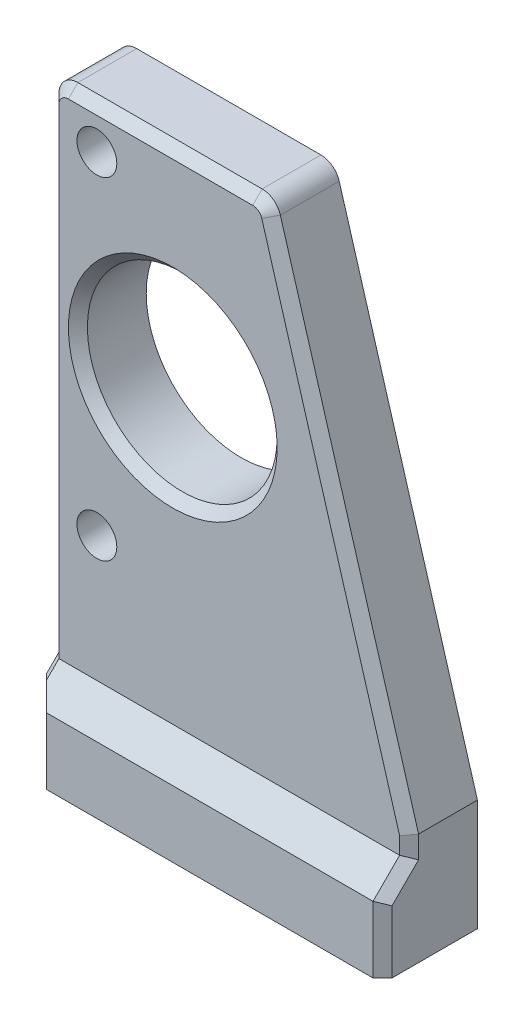
ISO-10303-21;
HEADER;
FILE_DESCRIPTION(('STEP AP214'),'2;1');
FILE_NAME('part.step','',(''),(''),'','','');
FILE_SCHEMA(('AUTOMOTIVE_DESIGN { 1 0 10303 214 1 1 1 1 }'));
ENDSEC;
DATA;
#1=APPLICATION_CONTEXT('core data for automotive mechanical design processes');
#2=APPLICATION_PROTOCOL_DEFINITION('international standard','automotive_design',2000,#1);
#3=PRODUCT_CONTEXT('',#1,'mechanical');
#4=PRODUCT('Part','Part','',(#3));
#5=PRODUCT_RELATED_PRODUCT_CATEGORY('part','',(#4));
#6=PRODUCT_DEFINITION_FORMATION('','',#4);
#7=PRODUCT_DEFINITION_CONTEXT('part definition',#1,'design');
#8=PRODUCT_DEFINITION('design','',#6,#7);
#9=PRODUCT_DEFINITION_SHAPE('','',#8);
#10=(LENGTH_UNIT() NAMED_UNIT(*) SI_UNIT(.MILLI.,.METRE.));
#11=(NAMED_UNIT(*) PLANE_ANGLE_UNIT() SI_UNIT($,.RADIAN.));
#12=(NAMED_UNIT(*) SI_UNIT($,.STERADIAN.) SOLID_ANGLE_UNIT());
#13=UNCERTAINTY_MEASURE_WITH_UNIT(LENGTH_MEASURE(1.E-05),#10,'distance_accuracy_value','');
#14=(GEOMETRIC_REPRESENTATION_CONTEXT(3) GLOBAL_UNCERTAINTY_ASSIGNED_CONTEXT((#13)) GLOBAL_UNIT_ASSIGNED_CONTEXT((#10,
#11,#12)) REPRESENTATION_CONTEXT('',''));
#15=CARTESIAN_POINT('',(0.,0.,0.));
#16=DIRECTION('',(0.,0.,1.));
#17=DIRECTION('',(1.,0.,0.));
#18=AXIS2_PLACEMENT_3D('',#15,#16,#17);
#19=CARTESIAN_POINT('',(-8.08878115586111,23.0319457170168,10.));
#20=DIRECTION('',(0.,0.,-1.));
#21=DIRECTION('',(-1.,0.,0.));
#22=AXIS2_PLACEMENT_3D('',#19,#20,#21);
#23=CYLINDRICAL_SURFACE('',#22,2.1);
#24=CARTESIAN_POINT('',(-8.08878115586111,23.0319457170168,3.60000000000001));
#25=DIRECTION('',(0.,0.,-1.));
#26=DIRECTION('',(-1.,0.,0.));
#27=AXIS2_PLACEMENT_3D('',#24,#25,#26);
#28=CIRCLE('',#27,2.1);
#29=CARTESIAN_POINT('',(-10.1887811558611,23.0319457170168,3.60000000000001));
#30=VERTEX_POINT('',#29);
#31=EDGE_CURVE('E44',#30,#30,#28,.T.);
#32=ORIENTED_EDGE('',*,*,#31,.T.);
#33=EDGE_LOOP('',(#32));
#34=FACE_BOUND('',#33,.T.);
#35=CARTESIAN_POINT('',(-8.08878115586111,23.0319457170168,7.2));
#36=DIRECTION('',(0.,0.,1.));
#37=DIRECTION('',(1.,0.,0.));
#38=AXIS2_PLACEMENT_3D('',#35,#36,#37);
#39=CIRCLE('',#38,2.1);
#40=CARTESIAN_POINT('',(-5.98878115586111,23.0319457170168,7.2));
#41=VERTEX_POINT('',#40);
#42=EDGE_CURVE('E183',#41,#41,#39,.T.);
#43=ORIENTED_EDGE('',*,*,#42,.T.);
#44=EDGE_LOOP('',(#43));
#45=FACE_BOUND('',#44,.T.);
#46=ADVANCED_FACE('F36',(#34,#45),#23,.F.);
#47=CARTESIAN_POINT('',(-13.0887811558611,62.3706180274269,10.));
#48=DIRECTION('',(0.,-1.,0.));
#49=DIRECTION('',(0.,0.,-1.));
#50=AXIS2_PLACEMENT_3D('',#47,#48,#49);
#51=PLANE('',#50);
#52=DIRECTION('',(0.,0.,-1.));
#53=VECTOR('',#52,1.);
#54=CARTESIAN_POINT('',(-11.0887811558611,62.3706180274269,10.));
#55=LINE('',#54,#53);
#56=CARTESIAN_POINT('',(-11.0887811558611,62.3706180274269,0.));
#57=VERTEX_POINT('',#56);
#58=CARTESIAN_POINT('',(-11.0887811558611,62.3706180274269,6.2));
#59=VERTEX_POINT('',#58);
#60=EDGE_CURVE('E201',#57,#59,#55,.F.);
#61=ORIENTED_EDGE('',*,*,#60,.T.);
#62=DIRECTION('',(1.,0.,0.));
#63=VECTOR('',#62,1.);
#64=CARTESIAN_POINT('',(8.33058138017552,62.3706180274269,6.2));
#65=LINE('',#64,#63);
#66=CARTESIAN_POINT('',(8.33058138017552,62.3706180274269,6.2));
#67=VERTEX_POINT('',#66);
#68=EDGE_CURVE('E249',#59,#67,#65,.T.);
#69=ORIENTED_EDGE('',*,*,#68,.T.);
#70=DIRECTION('',(0.,0.,-1.));
#71=VECTOR('',#70,1.);
#72=CARTESIAN_POINT('',(8.33058138017552,62.3706180274269,10.));
#73=LINE('',#72,#71);
#74=CARTESIAN_POINT('',(8.33058138017552,62.3706180274269,0.));
#75=VERTEX_POINT('',#74);
#76=EDGE_CURVE('E199',#67,#75,#73,.T.);
#77=ORIENTED_EDGE('',*,*,#76,.T.);
#78=DIRECTION('',(-1.,0.,0.));
#79=VECTOR('',#78,1.);
#80=CARTESIAN_POINT('',(-13.0887811558611,62.3706180274269,0.));
#81=LINE('',#80,#79);
#82=EDGE_CURVE('E177',#75,#57,#81,.T.);
#83=ORIENTED_EDGE('',*,*,#82,.T.);
#84=EDGE_LOOP('',(#61,#69,#77,#83));
#85=FACE_BOUND('',#84,.T.);
#86=ADVANCED_FACE('F298',(#85),#51,.F.);
#87=CARTESIAN_POINT('',(-8.08878115586112,58.0319457170168,10.));
#88=DIRECTION('',(0.,0.,-1.));
#89=DIRECTION('',(-1.,0.,0.));
#90=AXIS2_PLACEMENT_3D('',#87,#88,#89);
#91=CYLINDRICAL_SURFACE('',#90,2.1);
#92=CARTESIAN_POINT('',(-8.08878115586112,58.0319457170168,0.));
#93=DIRECTION('',(0.,0.,1.));
#94=DIRECTION('',(-1.,0.,0.));
#95=AXIS2_PLACEMENT_3D('',#92,#93,#94);
#96=CIRCLE('',#95,2.1);
#97=CARTESIAN_POINT('',(-10.1887811558611,58.0319457170168,0.));
#98=VERTEX_POINT('',#97);
#99=EDGE_CURVE('E423',#98,#98,#96,.T.);
#100=ORIENTED_EDGE('',*,*,#99,.F.);
#101=EDGE_LOOP('',(#100));
#102=FACE_BOUND('',#101,.T.);
#103=CARTESIAN_POINT('',(-8.08878115586112,58.0319457170168,7.2));
#104=DIRECTION('',(0.,0.,1.));
#105=DIRECTION('',(1.,0.,0.));
#106=AXIS2_PLACEMENT_3D('',#103,#104,#105);
#107=CIRCLE('',#106,2.1);
#108=CARTESIAN_POINT('',(-5.98878115586112,58.0319457170168,7.2));
#109=VERTEX_POINT('',#108);
#110=EDGE_CURVE('E186',#109,#109,#107,.T.);
#111=ORIENTED_EDGE('',*,*,#110,.T.);
#112=EDGE_LOOP('',(#111));
#113=FACE_BOUND('',#112,.T.);
#114=ADVANCED_FACE('F303',(#102,#113),#91,.F.);
#115=CARTESIAN_POINT('',(0.,0.,10.));
#116=DIRECTION('',(0.,0.,-1.));
#117=DIRECTION('',(-1.,0.,0.));
#118=AXIS2_PLACEMENT_3D('',#115,#116,#117);
#119=PLANE('',#118);
#120=DIRECTION('',(-1.,0.,0.));
#121=VECTOR('',#120,1.);
#122=CARTESIAN_POINT('',(0.,6.99999999999997,10.));
#123=LINE('',#122,#121);
#124=CARTESIAN_POINT('',(23.8127338897394,6.99999999999997,10.));
#125=VERTEX_POINT('',#124);
#126=CARTESIAN_POINT('',(-10.5887811558611,6.99999999999997,10.));
#127=VERTEX_POINT('',#126);
#128=EDGE_CURVE('E182',#125,#127,#123,.T.);
#129=ORIENTED_EDGE('',*,*,#128,.T.);
#130=DIRECTION('',(0.,-1.,0.));
#131=VECTOR('',#130,1.);
#132=CARTESIAN_POINT('',(-10.5887811558611,0.,10.));
#133=LINE('',#132,#131);
#134=CARTESIAN_POINT('',(-10.5887811558611,0.,10.));
#135=VERTEX_POINT('',#134);
#136=EDGE_CURVE('E251',#127,#135,#133,.T.);
#137=ORIENTED_EDGE('',*,*,#136,.T.);
#138=DIRECTION('',(1.,0.,0.));
#139=VECTOR('',#138,1.);
#140=CARTESIAN_POINT('',(28.2870012815656,0.,10.));
#141=LINE('',#140,#139);
#142=CARTESIAN_POINT('',(23.8127338897394,0.,10.));
#143=VERTEX_POINT('',#142);
#144=EDGE_CURVE('E173',#135,#143,#141,.T.);
#145=ORIENTED_EDGE('',*,*,#144,.T.);
#146=DIRECTION('',(0.,1.,0.));
#147=VECTOR('',#146,1.);
#148=CARTESIAN_POINT('',(23.8127338897394,0.,10.));
#149=LINE('',#148,#147);
#150=EDGE_CURVE('E225',#143,#125,#149,.T.);
#151=ORIENTED_EDGE('',*,*,#150,.T.);
#152=EDGE_LOOP('',(#129,#137,#145,#151));
#153=FACE_BOUND('',#152,.T.);
#154=ADVANCED_FACE('F312',(#153),#119,.F.);
#155=CARTESIAN_POINT('',(0.,0.,0.));
#156=DIRECTION('',(0.,0.,-1.));
#157=DIRECTION('',(-1.,0.,0.));
#158=AXIS2_PLACEMENT_3D('',#155,#156,#157);
#159=PLANE('',#158);
#160=CARTESIAN_POINT('',(-8.08878115586111,23.0319457170168,0.));
#161=DIRECTION('',(0.,0.,-1.));
#162=DIRECTION('',(-1.,0.,0.));
#163=AXIS2_PLACEMENT_3D('',#160,#161,#162);
#164=CIRCLE('',#163,3.6);
#165=CARTESIAN_POINT('',(-11.6887811558611,23.0319457170168,0.));
#166=VERTEX_POINT('',#165);
#167=EDGE_CURVE('E451',#166,#166,#164,.T.);
#168=ORIENTED_EDGE('',*,*,#167,.F.);
#169=EDGE_LOOP('',(#168));
#170=FACE_BOUND('',#169,.T.);
#171=DIRECTION('',(0.,-1.,0.));
#172=VECTOR('',#171,1.);
#173=CARTESIAN_POINT('',(-13.0887811558611,0.,0.));
#174=LINE('',#173,#172);
#175=CARTESIAN_POINT('',(-13.0887811558611,60.3706180274269,0.));
#176=VERTEX_POINT('',#175);
#177=CARTESIAN_POINT('',(-13.0887811558611,0.,0.));
#178=VERTEX_POINT('',#177);
#179=EDGE_CURVE('E174',#176,#178,#174,.T.);
#180=ORIENTED_EDGE('',*,*,#179,.F.);
#181=CARTESIAN_POINT('',(-11.0887811558611,60.3706180274269,0.));
#182=DIRECTION('',(0.,0.,-1.));
#183=DIRECTION('',(-1.,0.,0.));
#184=AXIS2_PLACEMENT_3D('',#181,#182,#183);
#185=CIRCLE('',#184,2.);
#186=EDGE_CURVE('E197',#176,#57,#185,.T.);
#187=ORIENTED_EDGE('',*,*,#186,.T.);
#188=ORIENTED_EDGE('',*,*,#82,.F.);
#189=CARTESIAN_POINT('',(8.33058138017552,60.3706180274269,0.));
#190=DIRECTION('',(0.,0.,-1.));
#191=DIRECTION('',(-1.,0.,0.));
#192=AXIS2_PLACEMENT_3D('',#189,#190,#191);
#193=CIRCLE('',#192,2.);
#194=CARTESIAN_POINT('',(10.2483242545276,60.9382995119514,0.));
#195=VERTEX_POINT('',#194);
#196=EDGE_CURVE('E195',#75,#195,#193,.T.);
#197=ORIENTED_EDGE('',*,*,#196,.T.);
#198=DIRECTION('',(-0.283840742262227,0.958871437176032,0.));
#199=VECTOR('',#198,1.);
#200=CARTESIAN_POINT('',(24.8127338897394,11.7367779571846,0.));
#201=LINE('',#200,#199);
#202=CARTESIAN_POINT('',(24.8127338897394,11.7367779571846,0.));
#203=VERTEX_POINT('',#202);
#204=EDGE_CURVE('E158',#203,#195,#201,.T.);
#205=ORIENTED_EDGE('',*,*,#204,.F.);
#206=DIRECTION('',(0.,1.,0.));
#207=VECTOR('',#206,1.);
#208=CARTESIAN_POINT('',(24.8127338897394,11.7367779571846,0.));
#209=LINE('',#208,#207);
#210=CARTESIAN_POINT('',(24.8127338897394,0.,0.));
#211=VERTEX_POINT('',#210);
#212=EDGE_CURVE('E149',#211,#203,#209,.T.);
#213=ORIENTED_EDGE('',*,*,#212,.F.);
#214=DIRECTION('',(1.,0.,0.));
#215=VECTOR('',#214,1.);
#216=CARTESIAN_POINT('',(28.2870012815656,0.,0.));
#217=LINE('',#216,#215);
#218=EDGE_CURVE('E165',#178,#211,#217,.T.);
#219=ORIENTED_EDGE('',*,*,#218,.F.);
#220=EDGE_LOOP('',(#180,#187,#188,#197,#205,#213,#219));
#221=FACE_BOUND('',#220,.T.);
#222=CARTESIAN_POINT('',(-0.0887811558611135,40.5319457170168,0.));
#223=DIRECTION('',(0.,0.,1.));
#224=DIRECTION('',(1.,0.,0.));
#225=AXIS2_PLACEMENT_3D('',#222,#223,#224);
#226=CIRCLE('',#225,10.);
#227=CARTESIAN_POINT('',(9.91121884413889,40.5319457170168,0.));
#228=VERTEX_POINT('',#227);
#229=EDGE_CURVE('E187',#228,#228,#226,.T.);
#230=ORIENTED_EDGE('',*,*,#229,.T.);
#231=EDGE_LOOP('',(#230));
#232=FACE_BOUND('',#231,.T.);
#233=ORIENTED_EDGE('',*,*,#99,.T.);
#234=EDGE_LOOP('',(#233));
#235=FACE_BOUND('',#234,.T.);
#236=ADVANCED_FACE('F163',(#170,#221,#232,#235),#159,.T.);
#237=CARTESIAN_POINT('',(-13.0887811558611,0.,10.));
#238=DIRECTION('',(1.,0.,0.));
#239=DIRECTION('',(0.,0.,-1.));
#240=AXIS2_PLACEMENT_3D('',#237,#238,#239);
#241=PLANE('',#240);
#242=DIRECTION('',(0.,0.,-1.));
#243=VECTOR('',#242,1.);
#244=CARTESIAN_POINT('',(-13.0887811558611,0.,10.));
#245=LINE('',#244,#243);
#246=CARTESIAN_POINT('',(-13.0887811558611,0.,7.49999999999999));
#247=VERTEX_POINT('',#246);
#248=EDGE_CURVE('E171',#247,#178,#245,.T.);
#249=ORIENTED_EDGE('',*,*,#248,.F.);
#250=DIRECTION('',(0.,1.,0.));
#251=VECTOR('',#250,1.);
#252=CARTESIAN_POINT('',(-13.0887811558611,0.,7.49999999999999));
#253=LINE('',#252,#251);
#254=CARTESIAN_POINT('',(-13.0887811558611,8.08578643762687,7.49999999999999));
#255=VERTEX_POINT('',#254);
#256=EDGE_CURVE('E59',#247,#255,#253,.T.);
#257=ORIENTED_EDGE('',*,*,#256,.T.);
#258=DIRECTION('',(0.,0.707106781186544,-0.707106781186551));
#259=VECTOR('',#258,1.);
#260=CARTESIAN_POINT('',(-13.0887811558611,9.0928932188134,6.49289321881346));
#261=LINE('',#260,#259);
#262=CARTESIAN_POINT('',(-13.0887811558611,9.38578643762685,6.2));
#263=VERTEX_POINT('',#262);
#264=EDGE_CURVE('E241',#255,#263,#261,.T.);
#265=ORIENTED_EDGE('',*,*,#264,.T.);
#266=DIRECTION('',(0.,1.,0.));
#267=VECTOR('',#266,1.);
#268=CARTESIAN_POINT('',(-13.0887811558611,60.3706180274269,6.2));
#269=LINE('',#268,#267);
#270=CARTESIAN_POINT('',(-13.0887811558611,60.3706180274269,6.2));
#271=VERTEX_POINT('',#270);
#272=EDGE_CURVE('E239',#263,#271,#269,.T.);
#273=ORIENTED_EDGE('',*,*,#272,.T.);
#274=DIRECTION('',(0.,0.,-1.));
#275=VECTOR('',#274,1.);
#276=CARTESIAN_POINT('',(-13.0887811558611,60.3706180274269,10.));
#277=LINE('',#276,#275);
#278=EDGE_CURVE('E193',#271,#176,#277,.T.);
#279=ORIENTED_EDGE('',*,*,#278,.T.);
#280=ORIENTED_EDGE('',*,*,#179,.T.);
#281=EDGE_LOOP('',(#249,#257,#265,#273,#279,#280));
#282=FACE_BOUND('',#281,.T.);
#283=ADVANCED_FACE('F319',(#282),#241,.F.);
#284=CARTESIAN_POINT('',(28.2870012815656,0.,10.));
#285=DIRECTION('',(0.,1.,0.));
#286=DIRECTION('',(-1.,0.,0.));
#287=AXIS2_PLACEMENT_3D('',#284,#285,#286);
#288=PLANE('',#287);
#289=CARTESIAN_POINT('',(6.18,0.,5.));
#290=DIRECTION('',(0.,-1.,0.));
#291=DIRECTION('',(1.,0.,0.));
#292=AXIS2_PLACEMENT_3D('',#289,#290,#291);
#293=CIRCLE('',#292,1.5);
#294=CARTESIAN_POINT('',(7.68,0.,5.));
#295=VERTEX_POINT('',#294);
#296=EDGE_CURVE('E440',#295,#295,#293,.T.);
#297=ORIENTED_EDGE('',*,*,#296,.F.);
#298=EDGE_LOOP('',(#297));
#299=FACE_BOUND('',#298,.T.);
#300=CARTESIAN_POINT('',(19.36,0.,5.));
#301=DIRECTION('',(0.,-1.,0.));
#302=DIRECTION('',(1.,0.,0.));
#303=AXIS2_PLACEMENT_3D('',#300,#301,#302);
#304=CIRCLE('',#303,1.5);
#305=CARTESIAN_POINT('',(20.86,0.,5.));
#306=VERTEX_POINT('',#305);
#307=EDGE_CURVE('E434',#306,#306,#304,.T.);
#308=ORIENTED_EDGE('',*,*,#307,.F.);
#309=EDGE_LOOP('',(#308));
#310=FACE_BOUND('',#309,.T.);
#311=CARTESIAN_POINT('',(-7.,0.,5.));
#312=DIRECTION('',(0.,-1.,0.));
#313=DIRECTION('',(1.,0.,0.));
#314=AXIS2_PLACEMENT_3D('',#311,#312,#313);
#315=CIRCLE('',#314,1.5);
#316=CARTESIAN_POINT('',(-5.5,0.,5.));
#317=VERTEX_POINT('',#316);
#318=EDGE_CURVE('E428',#317,#317,#315,.T.);
#319=ORIENTED_EDGE('',*,*,#318,.F.);
#320=EDGE_LOOP('',(#319));
#321=FACE_BOUND('',#320,.T.);
#322=ORIENTED_EDGE('',*,*,#144,.F.);
#323=DIRECTION('',(0.707106781186547,0.,0.707106781186549));
#324=VECTOR('',#323,1.);
#325=CARTESIAN_POINT('',(-10.5887811558611,0.,10.));
#326=LINE('',#325,#324);
#327=EDGE_CURVE('E277',#135,#247,#326,.F.);
#328=ORIENTED_EDGE('',*,*,#327,.T.);
#329=ORIENTED_EDGE('',*,*,#248,.T.);
#330=ORIENTED_EDGE('',*,*,#218,.T.);
#331=DIRECTION('',(0.,0.,-1.));
#332=VECTOR('',#331,1.);
#333=CARTESIAN_POINT('',(24.8127338897394,0.,10.));
#334=LINE('',#333,#332);
#335=CARTESIAN_POINT('',(24.8127338897394,0.,9.00000000000001));
#336=VERTEX_POINT('',#335);
#337=EDGE_CURVE('E145',#336,#211,#334,.T.);
#338=ORIENTED_EDGE('',*,*,#337,.F.);
#339=DIRECTION('',(0.70710678118655,0.,-0.707106781186545));
#340=VECTOR('',#339,1.);
#341=CARTESIAN_POINT('',(23.8127338897394,0.,10.));
#342=LINE('',#341,#340);
#343=EDGE_CURVE('E233',#336,#143,#342,.F.);
#344=ORIENTED_EDGE('',*,*,#343,.T.);
#345=EDGE_LOOP('',(#322,#328,#329,#330,#338,#344));
#346=FACE_BOUND('',#345,.T.);
#347=ADVANCED_FACE('F170',(#299,#310,#321,#346),#288,.F.);
#348=CARTESIAN_POINT('',(-7.,8.,5.));
#349=DIRECTION('',(0.,-1.,0.));
#350=DIRECTION('',(1.,0.,0.));
#351=AXIS2_PLACEMENT_3D('',#348,#349,#350);
#352=CYLINDRICAL_SURFACE('',#351,1.5);
#353=CARTESIAN_POINT('',(-7.,8.,5.));
#354=DIRECTION('',(0.,-1.,0.));
#355=DIRECTION('',(1.,0.,0.));
#356=AXIS2_PLACEMENT_3D('',#353,#354,#355);
#357=CIRCLE('',#356,1.5);
#358=CARTESIAN_POINT('',(-5.5,8.,5.));
#359=VERTEX_POINT('',#358);
#360=EDGE_CURVE('E425',#359,#359,#357,.T.);
#361=ORIENTED_EDGE('',*,*,#360,.F.);
#362=EDGE_LOOP('',(#361));
#363=FACE_BOUND('',#362,.T.);
#364=ORIENTED_EDGE('',*,*,#318,.T.);
#365=EDGE_LOOP('',(#364));
#366=FACE_BOUND('',#365,.T.);
#367=ADVANCED_FACE('F308',(#363,#366),#352,.F.);
#368=CARTESIAN_POINT('',(-7.,8.,5.));
#369=DIRECTION('',(0.,-1.,0.));
#370=DIRECTION('',(1.,0.,0.));
#371=AXIS2_PLACEMENT_3D('',#368,#369,#370);
#372=PLANE('',#371);
#373=ORIENTED_EDGE('',*,*,#360,.T.);
#374=EDGE_LOOP('',(#373));
#375=FACE_BOUND('',#374,.T.);
#376=ADVANCED_FACE('F488',(#375),#372,.T.);
#377=CARTESIAN_POINT('',(19.36,8.,5.));
#378=DIRECTION('',(0.,-1.,0.));
#379=DIRECTION('',(1.,0.,0.));
#380=AXIS2_PLACEMENT_3D('',#377,#378,#379);
#381=CYLINDRICAL_SURFACE('',#380,1.5);
#382=CARTESIAN_POINT('',(19.36,8.,5.));
#383=DIRECTION('',(0.,-1.,0.));
#384=DIRECTION('',(1.,0.,0.));
#385=AXIS2_PLACEMENT_3D('',#382,#383,#384);
#386=CIRCLE('',#385,1.5);
#387=CARTESIAN_POINT('',(20.86,8.,5.));
#388=VERTEX_POINT('',#387);
#389=EDGE_CURVE('E437',#388,#388,#386,.T.);
#390=ORIENTED_EDGE('',*,*,#389,.F.);
#391=EDGE_LOOP('',(#390));
#392=FACE_BOUND('',#391,.T.);
#393=ORIENTED_EDGE('',*,*,#307,.T.);
#394=EDGE_LOOP('',(#393));
#395=FACE_BOUND('',#394,.T.);
#396=ADVANCED_FACE('F485',(#392,#395),#381,.F.);
#397=CARTESIAN_POINT('',(19.36,8.,5.));
#398=DIRECTION('',(0.,-1.,0.));
#399=DIRECTION('',(1.,0.,0.));
#400=AXIS2_PLACEMENT_3D('',#397,#398,#399);
#401=PLANE('',#400);
#402=ORIENTED_EDGE('',*,*,#389,.T.);
#403=EDGE_LOOP('',(#402));
#404=FACE_BOUND('',#403,.T.);
#405=ADVANCED_FACE('F481',(#404),#401,.T.);
#406=CARTESIAN_POINT('',(6.18,8.,5.));
#407=DIRECTION('',(0.,-1.,0.));
#408=DIRECTION('',(1.,0.,0.));
#409=AXIS2_PLACEMENT_3D('',#406,#407,#408);
#410=CYLINDRICAL_SURFACE('',#409,1.5);
#411=CARTESIAN_POINT('',(6.18,8.,5.));
#412=DIRECTION('',(0.,-1.,0.));
#413=DIRECTION('',(1.,0.,0.));
#414=AXIS2_PLACEMENT_3D('',#411,#412,#413);
#415=CIRCLE('',#414,1.5);
#416=CARTESIAN_POINT('',(7.68,8.,5.));
#417=VERTEX_POINT('',#416);
#418=EDGE_CURVE('E431',#417,#417,#415,.T.);
#419=ORIENTED_EDGE('',*,*,#418,.F.);
#420=EDGE_LOOP('',(#419));
#421=FACE_BOUND('',#420,.T.);
#422=ORIENTED_EDGE('',*,*,#296,.T.);
#423=EDGE_LOOP('',(#422));
#424=FACE_BOUND('',#423,.T.);
#425=ADVANCED_FACE('F477',(#421,#424),#410,.F.);
#426=CARTESIAN_POINT('',(6.18,8.,5.));
#427=DIRECTION('',(0.,-1.,0.));
#428=DIRECTION('',(1.,0.,0.));
#429=AXIS2_PLACEMENT_3D('',#426,#427,#428);
#430=PLANE('',#429);
#431=ORIENTED_EDGE('',*,*,#418,.T.);
#432=EDGE_LOOP('',(#431));
#433=FACE_BOUND('',#432,.T.);
#434=ADVANCED_FACE('F473',(#433),#430,.T.);
#435=CARTESIAN_POINT('',(0.,0.,7.2));
#436=DIRECTION('',(0.,0.,1.));
#437=DIRECTION('',(1.,0.,0.));
#438=AXIS2_PLACEMENT_3D('',#435,#436,#437);
#439=PLANE('',#438);
#440=CARTESIAN_POINT('',(-0.0887811558611135,40.5319457170168,7.2));
#441=DIRECTION('',(0.,0.,1.));
#442=DIRECTION('',(1.,0.,0.));
#443=AXIS2_PLACEMENT_3D('',#440,#441,#442);
#444=CIRCLE('',#443,11.);
#445=CARTESIAN_POINT('',(10.9112188441389,40.5319457170168,7.2));
#446=VERTEX_POINT('',#445);
#447=EDGE_CURVE('E222',#446,#446,#444,.F.);
#448=ORIENTED_EDGE('',*,*,#447,.T.);
#449=EDGE_LOOP('',(#448));
#450=FACE_BOUND('',#449,.T.);
#451=DIRECTION('',(-1.,0.,0.));
#452=VECTOR('',#451,1.);
#453=CARTESIAN_POINT('',(-15.0951683588392,9.79999999999994,7.2));
#454=LINE('',#453,#452);
#455=CARTESIAN_POINT('',(-12.0887811558611,9.79999999999994,7.2));
#456=VERTEX_POINT('',#455);
#457=CARTESIAN_POINT('',(23.8127338897394,9.79999999999994,7.2));
#458=VERTEX_POINT('',#457);
#459=EDGE_CURVE('E190',#456,#458,#454,.F.);
#460=ORIENTED_EDGE('',*,*,#459,.T.);
#461=DIRECTION('',(0.,1.,0.));
#462=VECTOR('',#461,1.);
#463=CARTESIAN_POINT('',(23.8127338897394,11.7367779571846,7.2));
#464=LINE('',#463,#462);
#465=CARTESIAN_POINT('',(23.8127338897394,11.5918778188318,7.2));
#466=VERTEX_POINT('',#465);
#467=EDGE_CURVE('E220',#458,#466,#464,.T.);
#468=ORIENTED_EDGE('',*,*,#467,.T.);
#469=DIRECTION('',(-0.283840742262227,0.958871437176032,0.));
#470=VECTOR('',#469,1.);
#471=CARTESIAN_POINT('',(9.28945281735155,60.6544587696892,7.2));
#472=LINE('',#471,#470);
#473=CARTESIAN_POINT('',(9.28945281735156,60.6544587696892,7.2));
#474=VERTEX_POINT('',#473);
#475=EDGE_CURVE('E218',#466,#474,#472,.T.);
#476=ORIENTED_EDGE('',*,*,#475,.T.);
#477=CARTESIAN_POINT('',(8.33058138017552,60.3706180274269,7.2));
#478=DIRECTION('',(0.,0.,1.));
#479=DIRECTION('',(1.,0.,0.));
#480=AXIS2_PLACEMENT_3D('',#477,#478,#479);
#481=CIRCLE('',#480,1.00000000000001);
#482=CARTESIAN_POINT('',(8.33058138017552,61.3706180274269,7.2));
#483=VERTEX_POINT('',#482);
#484=EDGE_CURVE('E214',#474,#483,#481,.T.);
#485=ORIENTED_EDGE('',*,*,#484,.T.);
#486=DIRECTION('',(-1.,0.,0.));
#487=VECTOR('',#486,1.);
#488=CARTESIAN_POINT('',(-11.0887811558611,61.3706180274269,7.2));
#489=LINE('',#488,#487);
#490=CARTESIAN_POINT('',(-11.0887811558611,61.3706180274269,7.2));
#491=VERTEX_POINT('',#490);
#492=EDGE_CURVE('E210',#483,#491,#489,.T.);
#493=ORIENTED_EDGE('',*,*,#492,.T.);
#494=CARTESIAN_POINT('',(-11.0887811558611,60.3706180274269,7.2));
#495=DIRECTION('',(0.,0.,1.));
#496=DIRECTION('',(1.,0.,0.));
#497=AXIS2_PLACEMENT_3D('',#494,#495,#496);
#498=CIRCLE('',#497,1.00000000000001);
#499=CARTESIAN_POINT('',(-12.0887811558611,60.3706180274269,7.2));
#500=VERTEX_POINT('',#499);
#501=EDGE_CURVE('E212',#491,#500,#498,.T.);
#502=ORIENTED_EDGE('',*,*,#501,.T.);
#503=DIRECTION('',(0.,-1.,0.));
#504=VECTOR('',#503,1.);
#505=CARTESIAN_POINT('',(-12.0887811558611,9.79999999999994,7.2));
#506=LINE('',#505,#504);
#507=EDGE_CURVE('E216',#500,#456,#506,.T.);
#508=ORIENTED_EDGE('',*,*,#507,.T.);
#509=EDGE_LOOP('',(#460,#468,#476,#485,#493,#502,#508));
#510=FACE_BOUND('',#509,.T.);
#511=ORIENTED_EDGE('',*,*,#42,.F.);
#512=EDGE_LOOP('',(#511));
#513=FACE_BOUND('',#512,.T.);
#514=ORIENTED_EDGE('',*,*,#110,.F.);
#515=EDGE_LOOP('',(#514));
#516=FACE_BOUND('',#515,.T.);
#517=ADVANCED_FACE('F397',(#450,#510,#513,#516),#439,.T.);
#518=CARTESIAN_POINT('',(-0.0887811558611135,40.5319457170168,0.));
#519=DIRECTION('',(0.,0.,1.));
#520=DIRECTION('',(1.,0.,0.));
#521=AXIS2_PLACEMENT_3D('',#518,#519,#520);
#522=CYLINDRICAL_SURFACE('',#521,10.);
#523=CARTESIAN_POINT('',(-0.0887811558611135,40.5319457170168,6.2));
#524=DIRECTION('',(0.,0.,1.));
#525=DIRECTION('',(1.,0.,0.));
#526=AXIS2_PLACEMENT_3D('',#523,#524,#525);
#527=CIRCLE('',#526,10.);
#528=CARTESIAN_POINT('',(9.91121884413889,40.5319457170168,6.2));
#529=VERTEX_POINT('',#528);
#530=EDGE_CURVE('E207',#529,#529,#527,.T.);
#531=ORIENTED_EDGE('',*,*,#530,.T.);
#532=EDGE_LOOP('',(#531));
#533=FACE_BOUND('',#532,.T.);
#534=ORIENTED_EDGE('',*,*,#229,.F.);
#535=EDGE_LOOP('',(#534));
#536=FACE_BOUND('',#535,.T.);
#537=ADVANCED_FACE('F330',(#533,#536),#522,.F.);
#538=CARTESIAN_POINT('',(-15.0951683588392,9.99999999999999,6.99999999999995));
#539=DIRECTION('',(0.,-0.707106781186551,-0.707106781186544));
#540=DIRECTION('',(1.,0.,0.));
#541=AXIS2_PLACEMENT_3D('',#538,#539,#540);
#542=PLANE('',#541);
#543=DIRECTION('',(0.,0.707106781186544,-0.707106781186551));
#544=VECTOR('',#543,1.);
#545=CARTESIAN_POINT('',(-12.0887811558611,6.99999999999997,10.));
#546=LINE('',#545,#544);
#547=CARTESIAN_POINT('',(-12.0887811558611,8.49999999999996,8.49999999999999));
#548=VERTEX_POINT('',#547);
#549=EDGE_CURVE('E235',#456,#548,#546,.F.);
#550=ORIENTED_EDGE('',*,*,#549,.T.);
#551=DIRECTION('',(0.577350269189627,-0.577350269189622,0.577350269189628));
#552=VECTOR('',#551,1.);
#553=CARTESIAN_POINT('',(-14.0909102235205,10.5021290676594,6.49787093234058));
#554=LINE('',#553,#552);
#555=EDGE_CURVE('E281',#548,#127,#554,.T.);
#556=ORIENTED_EDGE('',*,*,#555,.T.);
#557=ORIENTED_EDGE('',*,*,#128,.F.);
#558=DIRECTION('',(0.,-0.707106781186544,0.707106781186551));
#559=VECTOR('',#558,1.);
#560=CARTESIAN_POINT('',(23.8127338897394,9.79999999999994,7.2));
#561=LINE('',#560,#559);
#562=EDGE_CURVE('E237',#125,#458,#561,.F.);
#563=ORIENTED_EDGE('',*,*,#562,.T.);
#564=ORIENTED_EDGE('',*,*,#459,.F.);
#565=EDGE_LOOP('',(#550,#556,#557,#563,#564));
#566=FACE_BOUND('',#565,.T.);
#567=ADVANCED_FACE('F326',(#566),#542,.F.);
#568=CARTESIAN_POINT('',(24.8127338897394,11.7367779571846,10.));
#569=DIRECTION('',(-0.958871437176032,-0.283840742262227,0.));
#570=DIRECTION('',(0.283840742262227,-0.958871437176032,0.));
#571=AXIS2_PLACEMENT_3D('',#568,#569,#570);
#572=PLANE('',#571);
#573=DIRECTION('',(0.,0.,-1.));
#574=VECTOR('',#573,1.);
#575=CARTESIAN_POINT('',(10.2483242545276,60.9382995119514,10.));
#576=LINE('',#575,#574);
#577=CARTESIAN_POINT('',(10.2483242545276,60.9382995119514,6.2));
#578=VERTEX_POINT('',#577);
#579=EDGE_CURVE('E204',#195,#578,#576,.F.);
#580=ORIENTED_EDGE('',*,*,#579,.T.);
#581=DIRECTION('',(0.283840742262227,-0.958871437176032,0.));
#582=VECTOR('',#581,1.);
#583=CARTESIAN_POINT('',(24.8127338897394,11.7367779571846,6.2));
#584=LINE('',#583,#582);
#585=CARTESIAN_POINT('',(24.8127338897394,11.7367779571846,6.2));
#586=VERTEX_POINT('',#585);
#587=EDGE_CURVE('E243',#578,#586,#584,.T.);
#588=ORIENTED_EDGE('',*,*,#587,.T.);
#589=DIRECTION('',(0.,0.,-1.));
#590=VECTOR('',#589,1.);
#591=CARTESIAN_POINT('',(24.8127338897394,11.7367779571846,10.));
#592=LINE('',#591,#590);
#593=EDGE_CURVE('E157',#586,#203,#592,.T.);
#594=ORIENTED_EDGE('',*,*,#593,.T.);
#595=ORIENTED_EDGE('',*,*,#204,.T.);
#596=EDGE_LOOP('',(#580,#588,#594,#595));
#597=FACE_BOUND('',#596,.T.);
#598=ADVANCED_FACE('F329',(#597),#572,.F.);
#599=CARTESIAN_POINT('',(24.8127338897394,11.7367779571846,10.));
#600=DIRECTION('',(-1.,0.,0.));
#601=DIRECTION('',(0.,-1.,0.));
#602=AXIS2_PLACEMENT_3D('',#599,#600,#601);
#603=PLANE('',#602);
#604=DIRECTION('',(0.,-0.707106781186544,0.707106781186551));
#605=VECTOR('',#604,1.);
#606=CARTESIAN_POINT('',(24.8127338897394,6.29289321881343,9.29289321881346));
#607=LINE('',#606,#605);
#608=CARTESIAN_POINT('',(24.8127338897394,9.38578643762685,6.20000000000001));
#609=VERTEX_POINT('',#608);
#610=CARTESIAN_POINT('',(24.8127338897394,6.58578643762688,9.00000000000001));
#611=VERTEX_POINT('',#610);
#612=EDGE_CURVE('E230',#609,#611,#607,.T.);
#613=ORIENTED_EDGE('',*,*,#612,.T.);
#614=DIRECTION('',(0.,-1.,0.));
#615=VECTOR('',#614,1.);
#616=CARTESIAN_POINT('',(24.8127338897394,11.7367779571846,9.00000000000001));
#617=LINE('',#616,#615);
#618=EDGE_CURVE('E152',#611,#336,#617,.T.);
#619=ORIENTED_EDGE('',*,*,#618,.T.);
#620=ORIENTED_EDGE('',*,*,#337,.T.);
#621=ORIENTED_EDGE('',*,*,#212,.T.);
#622=ORIENTED_EDGE('',*,*,#593,.F.);
#623=DIRECTION('',(0.,-1.,0.));
#624=VECTOR('',#623,1.);
#625=CARTESIAN_POINT('',(24.8127338897394,9.79999999999994,6.20000000000001));
#626=LINE('',#625,#624);
#627=EDGE_CURVE('E228',#586,#609,#626,.T.);
#628=ORIENTED_EDGE('',*,*,#627,.T.);
#629=EDGE_LOOP('',(#613,#619,#620,#621,#622,#628));
#630=FACE_BOUND('',#629,.T.);
#631=ADVANCED_FACE('F147',(#630),#603,.F.);
#632=CARTESIAN_POINT('',(-11.0887811558611,60.3706180274269,10.));
#633=DIRECTION('',(0.,0.,-1.));
#634=DIRECTION('',(-1.,0.,0.));
#635=AXIS2_PLACEMENT_3D('',#632,#633,#634);
#636=CYLINDRICAL_SURFACE('',#635,2.);
#637=ORIENTED_EDGE('',*,*,#278,.F.);
#638=CARTESIAN_POINT('',(-11.0887811558611,60.3706180274269,6.2));
#639=DIRECTION('',(0.,0.,1.));
#640=DIRECTION('',(1.,0.,0.));
#641=AXIS2_PLACEMENT_3D('',#638,#639,#640);
#642=CIRCLE('',#641,2.);
#643=EDGE_CURVE('E247',#271,#59,#642,.F.);
#644=ORIENTED_EDGE('',*,*,#643,.T.);
#645=ORIENTED_EDGE('',*,*,#60,.F.);
#646=ORIENTED_EDGE('',*,*,#186,.F.);
#647=EDGE_LOOP('',(#637,#644,#645,#646));
#648=FACE_BOUND('',#647,.T.);
#649=ADVANCED_FACE('F332',(#648),#636,.T.);
#650=CARTESIAN_POINT('',(8.33058138017552,60.3706180274269,10.));
#651=DIRECTION('',(0.,0.,-1.));
#652=DIRECTION('',(-1.,0.,0.));
#653=AXIS2_PLACEMENT_3D('',#650,#651,#652);
#654=CYLINDRICAL_SURFACE('',#653,2.);
#655=ORIENTED_EDGE('',*,*,#76,.F.);
#656=CARTESIAN_POINT('',(8.33058138017552,60.3706180274269,6.2));
#657=DIRECTION('',(0.,0.,1.));
#658=DIRECTION('',(1.,0.,0.));
#659=AXIS2_PLACEMENT_3D('',#656,#657,#658);
#660=CIRCLE('',#659,2.);
#661=EDGE_CURVE('E245',#67,#578,#660,.F.);
#662=ORIENTED_EDGE('',*,*,#661,.T.);
#663=ORIENTED_EDGE('',*,*,#579,.F.);
#664=ORIENTED_EDGE('',*,*,#196,.F.);
#665=EDGE_LOOP('',(#655,#662,#663,#664));
#666=FACE_BOUND('',#665,.T.);
#667=ADVANCED_FACE('F335',(#666),#654,.T.);
#668=CARTESIAN_POINT('',(-0.0887811558611135,40.5319457170168,6.2));
#669=DIRECTION('',(0.,0.,1.));
#670=DIRECTION('',(1.,0.,0.));
#671=AXIS2_PLACEMENT_3D('',#668,#669,#670);
#672=CONICAL_SURFACE('',#671,10.,0.785398163397452);
#673=ORIENTED_EDGE('',*,*,#447,.F.);
#674=EDGE_LOOP('',(#673));
#675=FACE_BOUND('',#674,.T.);
#676=ORIENTED_EDGE('',*,*,#530,.F.);
#677=EDGE_LOOP('',(#676));
#678=FACE_BOUND('',#677,.T.);
#679=ADVANCED_FACE('F339',(#675,#678),#672,.F.);
#680=CARTESIAN_POINT('',(-13.0887811558611,2.79289321881347,12.7928932188134));
#681=DIRECTION('',(0.707106781186546,-0.500000000000004,-0.499999999999999));
#682=DIRECTION('',(0.,0.707106781186544,-0.707106781186551));
#683=AXIS2_PLACEMENT_3D('',#680,#681,#682);
#684=PLANE('',#683);
#685=ORIENTED_EDGE('',*,*,#264,.F.);
#686=DIRECTION('',(0.678598344545847,0.281084637714816,0.678598344545849));
#687=VECTOR('',#686,1.);
#688=CARTESIAN_POINT('',(-11.6610118653527,8.67718784169525,8.92776929050839));
#689=LINE('',#688,#687);
#690=EDGE_CURVE('E51',#255,#548,#689,.T.);
#691=ORIENTED_EDGE('',*,*,#690,.T.);
#692=ORIENTED_EDGE('',*,*,#549,.F.);
#693=DIRECTION('',(-0.678598344545846,-0.281084637714813,-0.678598344545851));
#694=VECTOR('',#693,1.);
#695=CARTESIAN_POINT('',(-11.3103340789459,10.1224433368479,7.9784470769152));
#696=LINE('',#695,#694);
#697=EDGE_CURVE('E167',#263,#456,#696,.F.);
#698=ORIENTED_EDGE('',*,*,#697,.F.);
#699=EDGE_LOOP('',(#685,#691,#692,#698));
#700=FACE_BOUND('',#699,.T.);
#701=ADVANCED_FACE('F343',(#700),#684,.F.);
#702=CARTESIAN_POINT('',(-12.0887811558611,0.,7.2));
#703=DIRECTION('',(-0.70710678118655,0.,0.707106781186545));
#704=DIRECTION('',(0.,1.,0.));
#705=AXIS2_PLACEMENT_3D('',#702,#703,#704);
#706=PLANE('',#705);
#707=ORIENTED_EDGE('',*,*,#697,.T.);
#708=ORIENTED_EDGE('',*,*,#507,.F.);
#709=DIRECTION('',(0.707106781186545,0.,0.70710678118655));
#710=VECTOR('',#709,1.);
#711=CARTESIAN_POINT('',(-13.0887811558611,60.3706180274269,6.2));
#712=LINE('',#711,#710);
#713=EDGE_CURVE('E270',#271,#500,#712,.T.);
#714=ORIENTED_EDGE('',*,*,#713,.F.);
#715=ORIENTED_EDGE('',*,*,#272,.F.);
#716=EDGE_LOOP('',(#707,#708,#714,#715));
#717=FACE_BOUND('',#716,.T.);
#718=ADVANCED_FACE('F373',(#717),#706,.T.);
#719=CARTESIAN_POINT('',(-11.0887811558611,60.3706180274269,7.2));
#720=DIRECTION('',(0.,0.,-1.));
#721=DIRECTION('',(-1.,0.,0.));
#722=AXIS2_PLACEMENT_3D('',#719,#720,#721);
#723=CONICAL_SURFACE('',#722,1.00000000000001,0.785398163397444);
#724=ORIENTED_EDGE('',*,*,#713,.T.);
#725=ORIENTED_EDGE('',*,*,#501,.F.);
#726=DIRECTION('',(0.,-0.707106781186545,0.70710678118655));
#727=VECTOR('',#726,1.);
#728=CARTESIAN_POINT('',(-11.0887811558611,62.3706180274269,6.2));
#729=LINE('',#728,#727);
#730=EDGE_CURVE('E267',#59,#491,#729,.T.);
#731=ORIENTED_EDGE('',*,*,#730,.F.);
#732=ORIENTED_EDGE('',*,*,#643,.F.);
#733=EDGE_LOOP('',(#724,#725,#731,#732));
#734=FACE_BOUND('',#733,.T.);
#735=ADVANCED_FACE('F369',(#734),#723,.T.);
#736=CARTESIAN_POINT('',(0.,61.3706180274269,7.2));
#737=DIRECTION('',(0.,0.70710678118655,0.707106781186545));
#738=DIRECTION('',(1.,0.,0.));
#739=AXIS2_PLACEMENT_3D('',#736,#737,#738);
#740=PLANE('',#739);
#741=ORIENTED_EDGE('',*,*,#730,.T.);
#742=ORIENTED_EDGE('',*,*,#492,.F.);
#743=DIRECTION('',(0.,-0.707106781186545,0.70710678118655));
#744=VECTOR('',#743,1.);
#745=CARTESIAN_POINT('',(8.33058138017552,62.3706180274269,6.2));
#746=LINE('',#745,#744);
#747=EDGE_CURVE('E264',#67,#483,#746,.T.);
#748=ORIENTED_EDGE('',*,*,#747,.F.);
#749=ORIENTED_EDGE('',*,*,#68,.F.);
#750=EDGE_LOOP('',(#741,#742,#748,#749));
#751=FACE_BOUND('',#750,.T.);
#752=ADVANCED_FACE('F365',(#751),#740,.T.);
#753=CARTESIAN_POINT('',(8.33058138017552,60.3706180274269,7.2));
#754=DIRECTION('',(0.,0.,-1.));
#755=DIRECTION('',(-1.,0.,0.));
#756=AXIS2_PLACEMENT_3D('',#753,#754,#755);
#757=CONICAL_SURFACE('',#756,1.00000000000001,0.785398163397445);
#758=ORIENTED_EDGE('',*,*,#747,.T.);
#759=ORIENTED_EDGE('',*,*,#484,.F.);
#760=DIRECTION('',(-0.67802449551326,-0.200705713630642,0.70710678118655));
#761=VECTOR('',#760,1.);
#762=CARTESIAN_POINT('',(10.2483242545276,60.9382995119514,6.2));
#763=LINE('',#762,#761);
#764=EDGE_CURVE('E261',#578,#474,#763,.T.);
#765=ORIENTED_EDGE('',*,*,#764,.F.);
#766=ORIENTED_EDGE('',*,*,#661,.F.);
#767=EDGE_LOOP('',(#758,#759,#765,#766));
#768=FACE_BOUND('',#767,.T.);
#769=ADVANCED_FACE('F361',(#768),#757,.T.);
#770=CARTESIAN_POINT('',(24.8127338897394,11.7367779571846,6.2));
#771=DIRECTION('',(0.678024495513262,0.200705713630644,0.707106781186548));
#772=DIRECTION('',(-0.283840742262227,0.958871437176032,0.));
#773=AXIS2_PLACEMENT_3D('',#770,#771,#772);
#774=PLANE('',#773);
#775=ORIENTED_EDGE('',*,*,#764,.T.);
#776=ORIENTED_EDGE('',*,*,#475,.F.);
#777=DIRECTION('',(0.703424138955438,0.101926255055352,-0.703424138955433));
#778=VECTOR('',#777,1.);
#779=CARTESIAN_POINT('',(24.8127338897394,11.7367779571846,6.2));
#780=LINE('',#779,#778);
#781=EDGE_CURVE('E258',#586,#466,#780,.F.);
#782=ORIENTED_EDGE('',*,*,#781,.F.);
#783=ORIENTED_EDGE('',*,*,#587,.F.);
#784=EDGE_LOOP('',(#775,#776,#782,#783));
#785=FACE_BOUND('',#784,.T.);
#786=ADVANCED_FACE('F357',(#785),#774,.T.);
#787=CARTESIAN_POINT('',(24.8127338897394,11.7367779571846,6.20000000000001));
#788=DIRECTION('',(0.707106781186545,0.,0.70710678118655));
#789=DIRECTION('',(0.,1.,0.));
#790=AXIS2_PLACEMENT_3D('',#787,#788,#789);
#791=PLANE('',#790);
#792=ORIENTED_EDGE('',*,*,#781,.T.);
#793=ORIENTED_EDGE('',*,*,#467,.F.);
#794=DIRECTION('',(-0.678598344545849,0.281084637714825,0.678598344545844));
#795=VECTOR('',#794,1.);
#796=CARTESIAN_POINT('',(24.6172973180447,9.46673891620648,6.39543657169466));
#797=LINE('',#796,#795);
#798=EDGE_CURVE('E254',#609,#458,#797,.T.);
#799=ORIENTED_EDGE('',*,*,#798,.F.);
#800=ORIENTED_EDGE('',*,*,#627,.F.);
#801=EDGE_LOOP('',(#792,#793,#799,#800));
#802=FACE_BOUND('',#801,.T.);
#803=ADVANCED_FACE('F353',(#802),#791,.T.);
#804=CARTESIAN_POINT('',(24.8127338897394,8.66128219740573,6.92450424022113));
#805=DIRECTION('',(-0.707106781186547,-0.500000000000003,-0.499999999999998));
#806=DIRECTION('',(0.,-0.707106781186544,0.707106781186551));
#807=AXIS2_PLACEMENT_3D('',#804,#805,#806);
#808=PLANE('',#807);
#809=ORIENTED_EDGE('',*,*,#798,.T.);
#810=ORIENTED_EDGE('',*,*,#562,.F.);
#811=DIRECTION('',(0.678598344545849,-0.281084637714825,-0.678598344545844));
#812=VECTOR('',#811,1.);
#813=CARTESIAN_POINT('',(25.3726033195362,6.35388092664694,8.44013057020319));
#814=LINE('',#813,#812);
#815=EDGE_CURVE('E252',#611,#125,#814,.F.);
#816=ORIENTED_EDGE('',*,*,#815,.F.);
#817=ORIENTED_EDGE('',*,*,#612,.F.);
#818=EDGE_LOOP('',(#809,#810,#816,#817));
#819=FACE_BOUND('',#818,.T.);
#820=ADVANCED_FACE('F349',(#819),#808,.F.);
#821=CARTESIAN_POINT('',(23.8127338897394,0.,10.));
#822=DIRECTION('',(-0.707106781186545,0.,-0.70710678118655));
#823=DIRECTION('',(0.,1.,0.));
#824=AXIS2_PLACEMENT_3D('',#821,#822,#823);
#825=PLANE('',#824);
#826=ORIENTED_EDGE('',*,*,#343,.F.);
#827=ORIENTED_EDGE('',*,*,#618,.F.);
#828=ORIENTED_EDGE('',*,*,#815,.T.);
#829=ORIENTED_EDGE('',*,*,#150,.F.);
#830=EDGE_LOOP('',(#826,#827,#828,#829));
#831=FACE_BOUND('',#830,.T.);
#832=ADVANCED_FACE('F345',(#831),#825,.F.);
#833=CARTESIAN_POINT('',(-10.5887811558611,0.,10.));
#834=DIRECTION('',(0.707106781186549,0.,-0.707106781186547));
#835=DIRECTION('',(0.,-1.,0.));
#836=AXIS2_PLACEMENT_3D('',#833,#834,#835);
#837=PLANE('',#836);
#838=ORIENTED_EDGE('',*,*,#690,.F.);
#839=ORIENTED_EDGE('',*,*,#256,.F.);
#840=ORIENTED_EDGE('',*,*,#327,.F.);
#841=ORIENTED_EDGE('',*,*,#136,.F.);
#842=ORIENTED_EDGE('',*,*,#555,.F.);
#843=EDGE_LOOP('',(#838,#839,#840,#841,#842));
#844=FACE_BOUND('',#843,.T.);
#845=ADVANCED_FACE('F348',(#844),#837,.F.);
#846=CARTESIAN_POINT('',(-8.08878115586111,23.0319457170168,3.));
#847=DIRECTION('',(0.,0.,-1.));
#848=DIRECTION('',(-1.,0.,0.));
#849=AXIS2_PLACEMENT_3D('',#846,#847,#848);
#850=CYLINDRICAL_SURFACE('',#849,3.6);
#851=CARTESIAN_POINT('',(-8.08878115586111,23.0319457170168,3.));
#852=DIRECTION('',(0.,0.,-1.));
#853=DIRECTION('',(-1.,0.,0.));
#854=AXIS2_PLACEMENT_3D('',#851,#852,#853);
#855=CIRCLE('',#854,3.6);
#856=CARTESIAN_POINT('',(-11.6887811558611,23.0319457170168,3.));
#857=VERTEX_POINT('',#856);
#858=EDGE_CURVE('E255',#857,#857,#855,.T.);
#859=ORIENTED_EDGE('',*,*,#858,.F.);
#860=EDGE_LOOP('',(#859));
#861=FACE_BOUND('',#860,.T.);
#862=ORIENTED_EDGE('',*,*,#167,.T.);
#863=EDGE_LOOP('',(#862));
#864=FACE_BOUND('',#863,.T.);
#865=ADVANCED_FACE('F293',(#861,#864),#850,.F.);
#866=CARTESIAN_POINT('',(-8.08878115586111,23.0319457170168,3.));
#867=DIRECTION('',(0.,0.,-1.));
#868=DIRECTION('',(-1.,0.,0.));
#869=AXIS2_PLACEMENT_3D('',#866,#867,#868);
#870=PLANE('',#869);
#871=CARTESIAN_POINT('',(-8.08878115586111,23.0319457170168,3.));
#872=DIRECTION('',(0.,0.,-1.));
#873=DIRECTION('',(-1.,0.,0.));
#874=AXIS2_PLACEMENT_3D('',#871,#872,#873);
#875=CIRCLE('',#874,2.70000000000001);
#876=CARTESIAN_POINT('',(-10.7887811558611,23.0319457170168,3.));
#877=VERTEX_POINT('',#876);
#878=EDGE_CURVE('E11',#877,#877,#875,.F.);
#879=ORIENTED_EDGE('',*,*,#878,.T.);
#880=EDGE_LOOP('',(#879));
#881=FACE_BOUND('',#880,.T.);
#882=ORIENTED_EDGE('',*,*,#858,.T.);
#883=EDGE_LOOP('',(#882));
#884=FACE_BOUND('',#883,.T.);
#885=ADVANCED_FACE('F288',(#881,#884),#870,.T.);
#886=CARTESIAN_POINT('',(-8.08878115586111,23.0319457170168,3.60000000000001));
#887=DIRECTION('',(0.,0.,-1.));
#888=DIRECTION('',(-1.,0.,0.));
#889=AXIS2_PLACEMENT_3D('',#886,#887,#888);
#890=CONICAL_SURFACE('',#889,2.1,0.785398163397453);
#891=ORIENTED_EDGE('',*,*,#878,.F.);
#892=EDGE_LOOP('',(#891));
#893=FACE_BOUND('',#892,.T.);
#894=ORIENTED_EDGE('',*,*,#31,.F.);
#895=EDGE_LOOP('',(#894));
#896=FACE_BOUND('',#895,.T.);
#897=ADVANCED_FACE('F38',(#893,#896),#890,.F.);
#898=CLOSED_SHELL('',(#46,#86,#114,#154,#236,#283,#347,#367,#376,#396,#405,#425,#434,#517,#537,
#567,#598,#631,#649,#667,#679,#701,#718,#735,#752,#769,#786,#803,#820,#832,#845,#865,#885,#897));
#899=MANIFOLD_SOLID_BREP('B2',#898);
#900=ADVANCED_BREP_SHAPE_REPRESENTATION('',(#18,#899),#14);
#901=SHAPE_DEFINITION_REPRESENTATION(#9,#900);
ENDSEC;
END-ISO-10303-21;
